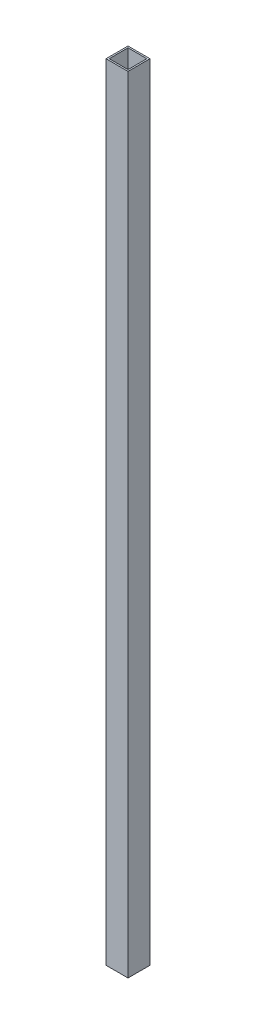
ISO-10303-21;
HEADER;
FILE_DESCRIPTION(('STEP AP214'),'2;1');
FILE_NAME('part.step','',(''),(''),'','','');
FILE_SCHEMA(('AUTOMOTIVE_DESIGN { 1 0 10303 214 1 1 1 1 }'));
ENDSEC;
DATA;
#1=APPLICATION_CONTEXT('core data for automotive mechanical design processes');
#2=APPLICATION_PROTOCOL_DEFINITION('international standard','automotive_design',2000,#1);
#3=PRODUCT_CONTEXT('',#1,'mechanical');
#4=PRODUCT('Part','Part','',(#3));
#5=PRODUCT_RELATED_PRODUCT_CATEGORY('part','',(#4));
#6=PRODUCT_DEFINITION_FORMATION('','',#4);
#7=PRODUCT_DEFINITION_CONTEXT('part definition',#1,'design');
#8=PRODUCT_DEFINITION('design','',#6,#7);
#9=PRODUCT_DEFINITION_SHAPE('','',#8);
#10=(LENGTH_UNIT() NAMED_UNIT(*) SI_UNIT(.MILLI.,.METRE.));
#11=(NAMED_UNIT(*) PLANE_ANGLE_UNIT() SI_UNIT($,.RADIAN.));
#12=(NAMED_UNIT(*) SI_UNIT($,.STERADIAN.) SOLID_ANGLE_UNIT());
#13=UNCERTAINTY_MEASURE_WITH_UNIT(LENGTH_MEASURE(1.E-05),#10,'distance_accuracy_value','');
#14=(GEOMETRIC_REPRESENTATION_CONTEXT(3) GLOBAL_UNCERTAINTY_ASSIGNED_CONTEXT((#13)) GLOBAL_UNIT_ASSIGNED_CONTEXT((#10,
#11,#12)) REPRESENTATION_CONTEXT('',''));
#15=CARTESIAN_POINT('',(0.,0.,0.));
#16=DIRECTION('',(0.,0.,1.));
#17=DIRECTION('',(1.,0.,0.));
#18=AXIS2_PLACEMENT_3D('',#15,#16,#17);
#19=CARTESIAN_POINT('',(0.,500.,0.));
#20=DIRECTION('',(0.,-1.,0.));
#21=DIRECTION('',(0.,0.,-1.));
#22=AXIS2_PLACEMENT_3D('',#19,#20,#21);
#23=PLANE('',#22);
#24=DIRECTION('',(0.,0.,-1.));
#25=VECTOR('',#24,1.);
#26=CARTESIAN_POINT('',(0.,500.,0.));
#27=LINE('',#26,#25);
#28=CARTESIAN_POINT('',(0.,500.,14.));
#29=VERTEX_POINT('',#28);
#30=CARTESIAN_POINT('',(0.,500.,0.));
#31=VERTEX_POINT('',#30);
#32=EDGE_CURVE('E134',#29,#31,#27,.T.);
#33=ORIENTED_EDGE('',*,*,#32,.T.);
#34=DIRECTION('',(-1.,0.,0.));
#35=VECTOR('',#34,1.);
#36=CARTESIAN_POINT('',(0.,500.,0.));
#37=LINE('',#36,#35);
#38=CARTESIAN_POINT('',(-14.,500.,0.));
#39=VERTEX_POINT('',#38);
#40=EDGE_CURVE('E137',#31,#39,#37,.T.);
#41=ORIENTED_EDGE('',*,*,#40,.T.);
#42=DIRECTION('',(0.,0.,1.));
#43=VECTOR('',#42,1.);
#44=CARTESIAN_POINT('',(-14.,500.,0.));
#45=LINE('',#44,#43);
#46=CARTESIAN_POINT('',(-14.,500.,14.));
#47=VERTEX_POINT('',#46);
#48=EDGE_CURVE('E140',#39,#47,#45,.T.);
#49=ORIENTED_EDGE('',*,*,#48,.T.);
#50=DIRECTION('',(1.,0.,0.));
#51=VECTOR('',#50,1.);
#52=CARTESIAN_POINT('',(0.,500.,14.));
#53=LINE('',#52,#51);
#54=EDGE_CURVE('E142',#47,#29,#53,.T.);
#55=ORIENTED_EDGE('',*,*,#54,.T.);
#56=EDGE_LOOP('',(#33,#41,#49,#55));
#57=FACE_BOUND('',#56,.T.);
#58=DIRECTION('',(0.,0.,-1.));
#59=VECTOR('',#58,1.);
#60=CARTESIAN_POINT('',(-1.,500.,1.));
#61=LINE('',#60,#59);
#62=CARTESIAN_POINT('',(-1.,500.,13.));
#63=VERTEX_POINT('',#62);
#64=CARTESIAN_POINT('',(-1.,500.,1.));
#65=VERTEX_POINT('',#64);
#66=EDGE_CURVE('E98',#63,#65,#61,.T.);
#67=ORIENTED_EDGE('',*,*,#66,.F.);
#68=DIRECTION('',(1.,0.,0.));
#69=VECTOR('',#68,1.);
#70=CARTESIAN_POINT('',(-1.,500.,13.));
#71=LINE('',#70,#69);
#72=CARTESIAN_POINT('',(-13.,500.,13.));
#73=VERTEX_POINT('',#72);
#74=EDGE_CURVE('E120',#73,#63,#71,.T.);
#75=ORIENTED_EDGE('',*,*,#74,.F.);
#76=DIRECTION('',(0.,0.,1.));
#77=VECTOR('',#76,1.);
#78=CARTESIAN_POINT('',(-13.,500.,1.));
#79=LINE('',#78,#77);
#80=CARTESIAN_POINT('',(-13.,500.,1.));
#81=VERTEX_POINT('',#80);
#82=EDGE_CURVE('E118',#81,#73,#79,.T.);
#83=ORIENTED_EDGE('',*,*,#82,.F.);
#84=DIRECTION('',(-1.,0.,0.));
#85=VECTOR('',#84,1.);
#86=CARTESIAN_POINT('',(-1.,500.,1.));
#87=LINE('',#86,#85);
#88=EDGE_CURVE('E106',#65,#81,#87,.T.);
#89=ORIENTED_EDGE('',*,*,#88,.F.);
#90=EDGE_LOOP('',(#67,#75,#83,#89));
#91=FACE_BOUND('',#90,.T.);
#92=ADVANCED_FACE('F33',(#57,#91),#23,.F.);
#93=CARTESIAN_POINT('',(0.,0.,0.));
#94=DIRECTION('',(0.,-1.,0.));
#95=DIRECTION('',(0.,0.,-1.));
#96=AXIS2_PLACEMENT_3D('',#93,#94,#95);
#97=PLANE('',#96);
#98=DIRECTION('',(0.,0.,-1.));
#99=VECTOR('',#98,1.);
#100=CARTESIAN_POINT('',(0.,0.,0.));
#101=LINE('',#100,#99);
#102=CARTESIAN_POINT('',(0.,0.,14.));
#103=VERTEX_POINT('',#102);
#104=CARTESIAN_POINT('',(0.,0.,0.));
#105=VERTEX_POINT('',#104);
#106=EDGE_CURVE('E114',#103,#105,#101,.T.);
#107=ORIENTED_EDGE('',*,*,#106,.F.);
#108=DIRECTION('',(1.,0.,0.));
#109=VECTOR('',#108,1.);
#110=CARTESIAN_POINT('',(0.,0.,14.));
#111=LINE('',#110,#109);
#112=CARTESIAN_POINT('',(-14.,0.,14.));
#113=VERTEX_POINT('',#112);
#114=EDGE_CURVE('E138',#113,#103,#111,.T.);
#115=ORIENTED_EDGE('',*,*,#114,.F.);
#116=DIRECTION('',(0.,0.,1.));
#117=VECTOR('',#116,1.);
#118=CARTESIAN_POINT('',(-14.,0.,0.));
#119=LINE('',#118,#117);
#120=CARTESIAN_POINT('',(-14.,0.,0.));
#121=VERTEX_POINT('',#120);
#122=EDGE_CURVE('E149',#121,#113,#119,.T.);
#123=ORIENTED_EDGE('',*,*,#122,.F.);
#124=DIRECTION('',(-1.,0.,0.));
#125=VECTOR('',#124,1.);
#126=CARTESIAN_POINT('',(0.,0.,0.));
#127=LINE('',#126,#125);
#128=EDGE_CURVE('E147',#105,#121,#127,.T.);
#129=ORIENTED_EDGE('',*,*,#128,.F.);
#130=EDGE_LOOP('',(#107,#115,#123,#129));
#131=FACE_BOUND('',#130,.T.);
#132=DIRECTION('',(1.,0.,0.));
#133=VECTOR('',#132,1.);
#134=CARTESIAN_POINT('',(-1.,0.,13.));
#135=LINE('',#134,#133);
#136=CARTESIAN_POINT('',(-13.,0.,13.));
#137=VERTEX_POINT('',#136);
#138=CARTESIAN_POINT('',(-1.,0.,13.));
#139=VERTEX_POINT('',#138);
#140=EDGE_CURVE('E107',#137,#139,#135,.T.);
#141=ORIENTED_EDGE('',*,*,#140,.T.);
#142=DIRECTION('',(0.,0.,-1.));
#143=VECTOR('',#142,1.);
#144=CARTESIAN_POINT('',(-1.,0.,1.));
#145=LINE('',#144,#143);
#146=CARTESIAN_POINT('',(-1.,0.,1.));
#147=VERTEX_POINT('',#146);
#148=EDGE_CURVE('E56',#139,#147,#145,.T.);
#149=ORIENTED_EDGE('',*,*,#148,.T.);
#150=DIRECTION('',(-1.,0.,0.));
#151=VECTOR('',#150,1.);
#152=CARTESIAN_POINT('',(-1.,0.,1.));
#153=LINE('',#152,#151);
#154=CARTESIAN_POINT('',(-13.,0.,1.));
#155=VERTEX_POINT('',#154);
#156=EDGE_CURVE('E113',#147,#155,#153,.T.);
#157=ORIENTED_EDGE('',*,*,#156,.T.);
#158=DIRECTION('',(0.,0.,1.));
#159=VECTOR('',#158,1.);
#160=CARTESIAN_POINT('',(-13.,0.,1.));
#161=LINE('',#160,#159);
#162=EDGE_CURVE('E126',#155,#137,#161,.T.);
#163=ORIENTED_EDGE('',*,*,#162,.T.);
#164=EDGE_LOOP('',(#141,#149,#157,#163));
#165=FACE_BOUND('',#164,.T.);
#166=ADVANCED_FACE('F167',(#131,#165),#97,.T.);
#167=CARTESIAN_POINT('',(0.,500.,0.));
#168=DIRECTION('',(-1.,0.,0.));
#169=DIRECTION('',(0.,0.,1.));
#170=AXIS2_PLACEMENT_3D('',#167,#168,#169);
#171=PLANE('',#170);
#172=ORIENTED_EDGE('',*,*,#106,.T.);
#173=DIRECTION('',(0.,-1.,0.));
#174=VECTOR('',#173,1.);
#175=CARTESIAN_POINT('',(0.,500.,0.));
#176=LINE('',#175,#174);
#177=EDGE_CURVE('E11',#31,#105,#176,.T.);
#178=ORIENTED_EDGE('',*,*,#177,.F.);
#179=ORIENTED_EDGE('',*,*,#32,.F.);
#180=DIRECTION('',(0.,-1.,0.));
#181=VECTOR('',#180,1.);
#182=CARTESIAN_POINT('',(0.,500.,14.));
#183=LINE('',#182,#181);
#184=EDGE_CURVE('E144',#29,#103,#183,.T.);
#185=ORIENTED_EDGE('',*,*,#184,.T.);
#186=EDGE_LOOP('',(#172,#178,#179,#185));
#187=FACE_BOUND('',#186,.T.);
#188=ADVANCED_FACE('F35',(#187),#171,.F.);
#189=CARTESIAN_POINT('',(0.,500.,0.));
#190=DIRECTION('',(0.,0.,1.));
#191=DIRECTION('',(1.,0.,0.));
#192=AXIS2_PLACEMENT_3D('',#189,#190,#191);
#193=PLANE('',#192);
#194=ORIENTED_EDGE('',*,*,#128,.T.);
#195=DIRECTION('',(0.,-1.,0.));
#196=VECTOR('',#195,1.);
#197=CARTESIAN_POINT('',(-14.,500.,0.));
#198=LINE('',#197,#196);
#199=EDGE_CURVE('E41',#39,#121,#198,.T.);
#200=ORIENTED_EDGE('',*,*,#199,.F.);
#201=ORIENTED_EDGE('',*,*,#40,.F.);
#202=ORIENTED_EDGE('',*,*,#177,.T.);
#203=EDGE_LOOP('',(#194,#200,#201,#202));
#204=FACE_BOUND('',#203,.T.);
#205=ADVANCED_FACE('F177',(#204),#193,.F.);
#206=CARTESIAN_POINT('',(-14.,500.,0.));
#207=DIRECTION('',(1.,0.,0.));
#208=DIRECTION('',(0.,0.,-1.));
#209=AXIS2_PLACEMENT_3D('',#206,#207,#208);
#210=PLANE('',#209);
#211=ORIENTED_EDGE('',*,*,#122,.T.);
#212=DIRECTION('',(0.,-1.,0.));
#213=VECTOR('',#212,1.);
#214=CARTESIAN_POINT('',(-14.,500.,14.));
#215=LINE('',#214,#213);
#216=EDGE_CURVE('E154',#47,#113,#215,.T.);
#217=ORIENTED_EDGE('',*,*,#216,.F.);
#218=ORIENTED_EDGE('',*,*,#48,.F.);
#219=ORIENTED_EDGE('',*,*,#199,.T.);
#220=EDGE_LOOP('',(#211,#217,#218,#219));
#221=FACE_BOUND('',#220,.T.);
#222=ADVANCED_FACE('F161',(#221),#210,.F.);
#223=CARTESIAN_POINT('',(0.,500.,14.));
#224=DIRECTION('',(0.,0.,-1.));
#225=DIRECTION('',(-1.,0.,0.));
#226=AXIS2_PLACEMENT_3D('',#223,#224,#225);
#227=PLANE('',#226);
#228=ORIENTED_EDGE('',*,*,#114,.T.);
#229=ORIENTED_EDGE('',*,*,#184,.F.);
#230=ORIENTED_EDGE('',*,*,#54,.F.);
#231=ORIENTED_EDGE('',*,*,#216,.T.);
#232=EDGE_LOOP('',(#228,#229,#230,#231));
#233=FACE_BOUND('',#232,.T.);
#234=ADVANCED_FACE('F171',(#233),#227,.F.);
#235=CARTESIAN_POINT('',(-1.,500.,1.));
#236=DIRECTION('',(-1.,0.,0.));
#237=DIRECTION('',(0.,0.,1.));
#238=AXIS2_PLACEMENT_3D('',#235,#236,#237);
#239=PLANE('',#238);
#240=ORIENTED_EDGE('',*,*,#148,.F.);
#241=DIRECTION('',(0.,-1.,0.));
#242=VECTOR('',#241,1.);
#243=CARTESIAN_POINT('',(-1.,500.,13.));
#244=LINE('',#243,#242);
#245=EDGE_CURVE('E102',#63,#139,#244,.T.);
#246=ORIENTED_EDGE('',*,*,#245,.F.);
#247=ORIENTED_EDGE('',*,*,#66,.T.);
#248=DIRECTION('',(0.,-1.,0.));
#249=VECTOR('',#248,1.);
#250=CARTESIAN_POINT('',(-1.,500.,1.));
#251=LINE('',#250,#249);
#252=EDGE_CURVE('E101',#65,#147,#251,.T.);
#253=ORIENTED_EDGE('',*,*,#252,.T.);
#254=EDGE_LOOP('',(#240,#246,#247,#253));
#255=FACE_BOUND('',#254,.T.);
#256=ADVANCED_FACE('F100',(#255),#239,.T.);
#257=CARTESIAN_POINT('',(-1.,500.,1.));
#258=DIRECTION('',(0.,0.,1.));
#259=DIRECTION('',(1.,0.,0.));
#260=AXIS2_PLACEMENT_3D('',#257,#258,#259);
#261=PLANE('',#260);
#262=ORIENTED_EDGE('',*,*,#156,.F.);
#263=ORIENTED_EDGE('',*,*,#252,.F.);
#264=ORIENTED_EDGE('',*,*,#88,.T.);
#265=DIRECTION('',(0.,-1.,0.));
#266=VECTOR('',#265,1.);
#267=CARTESIAN_POINT('',(-13.,500.,1.));
#268=LINE('',#267,#266);
#269=EDGE_CURVE('E115',#81,#155,#268,.T.);
#270=ORIENTED_EDGE('',*,*,#269,.T.);
#271=EDGE_LOOP('',(#262,#263,#264,#270));
#272=FACE_BOUND('',#271,.T.);
#273=ADVANCED_FACE('F110',(#272),#261,.T.);
#274=CARTESIAN_POINT('',(-13.,500.,1.));
#275=DIRECTION('',(1.,0.,0.));
#276=DIRECTION('',(0.,0.,-1.));
#277=AXIS2_PLACEMENT_3D('',#274,#275,#276);
#278=PLANE('',#277);
#279=ORIENTED_EDGE('',*,*,#162,.F.);
#280=ORIENTED_EDGE('',*,*,#269,.F.);
#281=ORIENTED_EDGE('',*,*,#82,.T.);
#282=DIRECTION('',(0.,-1.,0.));
#283=VECTOR('',#282,1.);
#284=CARTESIAN_POINT('',(-13.,500.,13.));
#285=LINE('',#284,#283);
#286=EDGE_CURVE('E48',#73,#137,#285,.T.);
#287=ORIENTED_EDGE('',*,*,#286,.T.);
#288=EDGE_LOOP('',(#279,#280,#281,#287));
#289=FACE_BOUND('',#288,.T.);
#290=ADVANCED_FACE('F200',(#289),#278,.T.);
#291=CARTESIAN_POINT('',(-1.,500.,13.));
#292=DIRECTION('',(0.,0.,-1.));
#293=DIRECTION('',(-1.,0.,0.));
#294=AXIS2_PLACEMENT_3D('',#291,#292,#293);
#295=PLANE('',#294);
#296=ORIENTED_EDGE('',*,*,#140,.F.);
#297=ORIENTED_EDGE('',*,*,#286,.F.);
#298=ORIENTED_EDGE('',*,*,#74,.T.);
#299=ORIENTED_EDGE('',*,*,#245,.T.);
#300=EDGE_LOOP('',(#296,#297,#298,#299));
#301=FACE_BOUND('',#300,.T.);
#302=ADVANCED_FACE('F204',(#301),#295,.T.);
#303=CLOSED_SHELL('',(#92,#166,#188,#205,#222,#234,#256,#273,#290,#302));
#304=MANIFOLD_SOLID_BREP('B2',#303);
#305=ADVANCED_BREP_SHAPE_REPRESENTATION('',(#18,#304),#14);
#306=SHAPE_DEFINITION_REPRESENTATION(#9,#305);
ENDSEC;
END-ISO-10303-21;
